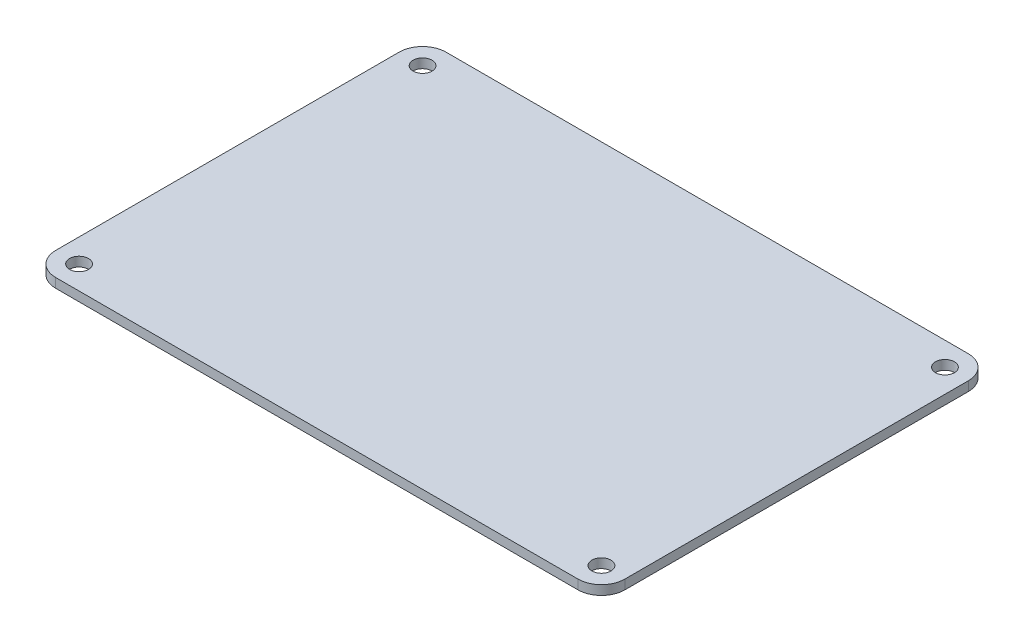
ISO-10303-21;
HEADER;
FILE_DESCRIPTION(('STEP AP214'),'2;1');
FILE_NAME('part.step','',(''),(''),'','','');
FILE_SCHEMA(('AUTOMOTIVE_DESIGN { 1 0 10303 214 1 1 1 1 }'));
ENDSEC;
DATA;
#1=APPLICATION_CONTEXT('core data for automotive mechanical design processes');
#2=APPLICATION_PROTOCOL_DEFINITION('international standard','automotive_design',2000,#1);
#3=PRODUCT_CONTEXT('',#1,'mechanical');
#4=PRODUCT('Part','Part','',(#3));
#5=PRODUCT_RELATED_PRODUCT_CATEGORY('part','',(#4));
#6=PRODUCT_DEFINITION_FORMATION('','',#4);
#7=PRODUCT_DEFINITION_CONTEXT('part definition',#1,'design');
#8=PRODUCT_DEFINITION('design','',#6,#7);
#9=PRODUCT_DEFINITION_SHAPE('','',#8);
#10=(LENGTH_UNIT() NAMED_UNIT(*) SI_UNIT(.MILLI.,.METRE.));
#11=(NAMED_UNIT(*) PLANE_ANGLE_UNIT() SI_UNIT($,.RADIAN.));
#12=(NAMED_UNIT(*) SI_UNIT($,.STERADIAN.) SOLID_ANGLE_UNIT());
#13=UNCERTAINTY_MEASURE_WITH_UNIT(LENGTH_MEASURE(1.E-05),#10,'distance_accuracy_value','');
#14=(GEOMETRIC_REPRESENTATION_CONTEXT(3) GLOBAL_UNCERTAINTY_ASSIGNED_CONTEXT((#13)) GLOBAL_UNIT_ASSIGNED_CONTEXT((#10,
#11,#12)) REPRESENTATION_CONTEXT('',''));
#15=CARTESIAN_POINT('',(0.,0.,0.));
#16=DIRECTION('',(0.,0.,1.));
#17=DIRECTION('',(1.,0.,0.));
#18=AXIS2_PLACEMENT_3D('',#15,#16,#17);
#19=CARTESIAN_POINT('',(0.,2.,-39.16));
#20=DIRECTION('',(0.,0.,1.));
#21=DIRECTION('',(1.,0.,0.));
#22=AXIS2_PLACEMENT_3D('',#19,#20,#21);
#23=PLANE('',#22);
#24=DIRECTION('',(-1.,0.,0.));
#25=VECTOR('',#24,1.);
#26=CARTESIAN_POINT('',(0.,1.,-39.16));
#27=LINE('',#26,#25);
#28=CARTESIAN_POINT('',(55.75,1.,-39.16));
#29=VERTEX_POINT('',#28);
#30=CARTESIAN_POINT('',(0.,1.,-39.16));
#31=VERTEX_POINT('',#30);
#32=EDGE_CURVE('E99',#29,#31,#27,.T.);
#33=ORIENTED_EDGE('',*,*,#32,.F.);
#34=DIRECTION('',(0.,-1.,0.));
#35=VECTOR('',#34,1.);
#36=CARTESIAN_POINT('',(55.75,2.,-39.16));
#37=LINE('',#36,#35);
#38=CARTESIAN_POINT('',(55.75,0.,-39.16));
#39=VERTEX_POINT('',#38);
#40=EDGE_CURVE('E11',#29,#39,#37,.T.);
#41=ORIENTED_EDGE('',*,*,#40,.T.);
#42=DIRECTION('',(-1.,0.,0.));
#43=VECTOR('',#42,1.);
#44=CARTESIAN_POINT('',(0.,0.,-39.16));
#45=LINE('',#44,#43);
#46=CARTESIAN_POINT('',(0.,0.,-39.16));
#47=VERTEX_POINT('',#46);
#48=EDGE_CURVE('E120',#39,#47,#45,.T.);
#49=ORIENTED_EDGE('',*,*,#48,.T.);
#50=DIRECTION('',(0.,-1.,0.));
#51=VECTOR('',#50,1.);
#52=CARTESIAN_POINT('',(0.,2.,-39.16));
#53=LINE('',#52,#51);
#54=EDGE_CURVE('E44',#31,#47,#53,.T.);
#55=ORIENTED_EDGE('',*,*,#54,.F.);
#56=EDGE_LOOP('',(#33,#41,#49,#55));
#57=FACE_BOUND('',#56,.T.);
#58=ADVANCED_FACE('F37',(#57),#23,.F.);
#59=CARTESIAN_POINT('',(-2.5,2.,0.));
#60=DIRECTION('',(1.,0.,0.));
#61=DIRECTION('',(0.,0.,-1.));
#62=AXIS2_PLACEMENT_3D('',#59,#60,#61);
#63=PLANE('',#62);
#64=DIRECTION('',(0.,0.,1.));
#65=VECTOR('',#64,1.);
#66=CARTESIAN_POINT('',(-2.5,1.,0.));
#67=LINE('',#66,#65);
#68=CARTESIAN_POINT('',(-2.5,1.,-36.66));
#69=VERTEX_POINT('',#68);
#70=CARTESIAN_POINT('',(-2.5,1.,0.));
#71=VERTEX_POINT('',#70);
#72=EDGE_CURVE('E116',#69,#71,#67,.T.);
#73=ORIENTED_EDGE('',*,*,#72,.F.);
#74=DIRECTION('',(0.,-1.,0.));
#75=VECTOR('',#74,1.);
#76=CARTESIAN_POINT('',(-2.5,2.,-36.66));
#77=LINE('',#76,#75);
#78=CARTESIAN_POINT('',(-2.5,0.,-36.66));
#79=VERTEX_POINT('',#78);
#80=EDGE_CURVE('E115',#69,#79,#77,.T.);
#81=ORIENTED_EDGE('',*,*,#80,.T.);
#82=DIRECTION('',(0.,0.,1.));
#83=VECTOR('',#82,1.);
#84=CARTESIAN_POINT('',(-2.5,0.,0.));
#85=LINE('',#84,#83);
#86=CARTESIAN_POINT('',(-2.5,0.,0.));
#87=VERTEX_POINT('',#86);
#88=EDGE_CURVE('E138',#79,#87,#85,.T.);
#89=ORIENTED_EDGE('',*,*,#88,.T.);
#90=DIRECTION('',(0.,-1.,0.));
#91=VECTOR('',#90,1.);
#92=CARTESIAN_POINT('',(-2.5,2.,0.));
#93=LINE('',#92,#91);
#94=EDGE_CURVE('E121',#71,#87,#93,.T.);
#95=ORIENTED_EDGE('',*,*,#94,.F.);
#96=EDGE_LOOP('',(#73,#81,#89,#95));
#97=FACE_BOUND('',#96,.T.);
#98=ADVANCED_FACE('F192',(#97),#63,.F.);
#99=CARTESIAN_POINT('',(0.,2.,2.5));
#100=DIRECTION('',(0.,0.,-1.));
#101=DIRECTION('',(-1.,0.,0.));
#102=AXIS2_PLACEMENT_3D('',#99,#100,#101);
#103=PLANE('',#102);
#104=DIRECTION('',(1.,0.,0.));
#105=VECTOR('',#104,1.);
#106=CARTESIAN_POINT('',(0.,1.,2.5));
#107=LINE('',#106,#105);
#108=CARTESIAN_POINT('',(0.,1.,2.5));
#109=VERTEX_POINT('',#108);
#110=CARTESIAN_POINT('',(55.75,1.,2.5));
#111=VERTEX_POINT('',#110);
#112=EDGE_CURVE('E180',#109,#111,#107,.T.);
#113=ORIENTED_EDGE('',*,*,#112,.F.);
#114=DIRECTION('',(0.,-1.,0.));
#115=VECTOR('',#114,1.);
#116=CARTESIAN_POINT('',(0.,2.,2.5));
#117=LINE('',#116,#115);
#118=CARTESIAN_POINT('',(0.,0.,2.5));
#119=VERTEX_POINT('',#118);
#120=EDGE_CURVE('E125',#109,#119,#117,.T.);
#121=ORIENTED_EDGE('',*,*,#120,.T.);
#122=DIRECTION('',(1.,0.,0.));
#123=VECTOR('',#122,1.);
#124=CARTESIAN_POINT('',(0.,0.,2.5));
#125=LINE('',#124,#123);
#126=CARTESIAN_POINT('',(55.75,0.,2.5));
#127=VERTEX_POINT('',#126);
#128=EDGE_CURVE('E135',#119,#127,#125,.T.);
#129=ORIENTED_EDGE('',*,*,#128,.T.);
#130=DIRECTION('',(0.,-1.,0.));
#131=VECTOR('',#130,1.);
#132=CARTESIAN_POINT('',(55.75,2.,2.5));
#133=LINE('',#132,#131);
#134=EDGE_CURVE('E127',#111,#127,#133,.T.);
#135=ORIENTED_EDGE('',*,*,#134,.F.);
#136=EDGE_LOOP('',(#113,#121,#129,#135));
#137=FACE_BOUND('',#136,.T.);
#138=ADVANCED_FACE('F202',(#137),#103,.F.);
#139=CARTESIAN_POINT('',(58.25,2.,0.));
#140=DIRECTION('',(-1.,0.,0.));
#141=DIRECTION('',(0.,0.,1.));
#142=AXIS2_PLACEMENT_3D('',#139,#140,#141);
#143=PLANE('',#142);
#144=DIRECTION('',(0.,0.,-1.));
#145=VECTOR('',#144,1.);
#146=CARTESIAN_POINT('',(58.25,1.,0.));
#147=LINE('',#146,#145);
#148=CARTESIAN_POINT('',(58.25,1.,0.));
#149=VERTEX_POINT('',#148);
#150=CARTESIAN_POINT('',(58.25,1.,-36.66));
#151=VERTEX_POINT('',#150);
#152=EDGE_CURVE('E51',#149,#151,#147,.T.);
#153=ORIENTED_EDGE('',*,*,#152,.F.);
#154=DIRECTION('',(0.,-1.,0.));
#155=VECTOR('',#154,1.);
#156=CARTESIAN_POINT('',(58.25,2.,0.));
#157=LINE('',#156,#155);
#158=CARTESIAN_POINT('',(58.25,0.,0.));
#159=VERTEX_POINT('',#158);
#160=EDGE_CURVE('E129',#149,#159,#157,.T.);
#161=ORIENTED_EDGE('',*,*,#160,.T.);
#162=DIRECTION('',(0.,0.,-1.));
#163=VECTOR('',#162,1.);
#164=CARTESIAN_POINT('',(58.25,0.,0.));
#165=LINE('',#164,#163);
#166=CARTESIAN_POINT('',(58.25,0.,-36.66));
#167=VERTEX_POINT('',#166);
#168=EDGE_CURVE('E132',#159,#167,#165,.T.);
#169=ORIENTED_EDGE('',*,*,#168,.T.);
#170=DIRECTION('',(0.,-1.,0.));
#171=VECTOR('',#170,1.);
#172=CARTESIAN_POINT('',(58.25,2.,-36.66));
#173=LINE('',#172,#171);
#174=EDGE_CURVE('E58',#151,#167,#173,.T.);
#175=ORIENTED_EDGE('',*,*,#174,.F.);
#176=EDGE_LOOP('',(#153,#161,#169,#175));
#177=FACE_BOUND('',#176,.T.);
#178=ADVANCED_FACE('F208',(#177),#143,.F.);
#179=CARTESIAN_POINT('',(55.75,2.,0.));
#180=DIRECTION('',(0.,-1.,0.));
#181=DIRECTION('',(0.,0.,-1.));
#182=AXIS2_PLACEMENT_3D('',#179,#180,#181);
#183=CYLINDRICAL_SURFACE('',#182,1.012);
#184=CARTESIAN_POINT('',(55.75,0.,0.));
#185=DIRECTION('',(0.,1.,0.));
#186=DIRECTION('',(0.,0.,1.));
#187=AXIS2_PLACEMENT_3D('',#184,#185,#186);
#188=CIRCLE('',#187,1.012);
#189=CARTESIAN_POINT('',(55.75,0.,1.012));
#190=VERTEX_POINT('',#189);
#191=EDGE_CURVE('E145',#190,#190,#188,.T.);
#192=ORIENTED_EDGE('',*,*,#191,.F.);
#193=EDGE_LOOP('',(#192));
#194=FACE_BOUND('',#193,.T.);
#195=CARTESIAN_POINT('',(55.75,1.,0.));
#196=DIRECTION('',(0.,1.,0.));
#197=DIRECTION('',(0.,0.,1.));
#198=AXIS2_PLACEMENT_3D('',#195,#196,#197);
#199=CIRCLE('',#198,1.012);
#200=CARTESIAN_POINT('',(55.75,1.,1.012));
#201=VERTEX_POINT('',#200);
#202=EDGE_CURVE('E173',#201,#201,#199,.F.);
#203=ORIENTED_EDGE('',*,*,#202,.F.);
#204=EDGE_LOOP('',(#203));
#205=FACE_BOUND('',#204,.T.);
#206=ADVANCED_FACE('F233',(#194,#205),#183,.F.);
#207=CARTESIAN_POINT('',(55.75,2.,0.));
#208=DIRECTION('',(0.,-1.,0.));
#209=DIRECTION('',(0.,0.,-1.));
#210=AXIS2_PLACEMENT_3D('',#207,#208,#209);
#211=CYLINDRICAL_SURFACE('',#210,2.5);
#212=CARTESIAN_POINT('',(55.75,1.,0.));
#213=DIRECTION('',(0.,1.,0.));
#214=DIRECTION('',(0.,0.,1.));
#215=AXIS2_PLACEMENT_3D('',#212,#213,#214);
#216=CIRCLE('',#215,2.5);
#217=EDGE_CURVE('E178',#111,#149,#216,.T.);
#218=ORIENTED_EDGE('',*,*,#217,.F.);
#219=ORIENTED_EDGE('',*,*,#134,.T.);
#220=CARTESIAN_POINT('',(55.75,0.,0.));
#221=DIRECTION('',(0.,1.,0.));
#222=DIRECTION('',(0.,0.,1.));
#223=AXIS2_PLACEMENT_3D('',#220,#221,#222);
#224=CIRCLE('',#223,2.5);
#225=EDGE_CURVE('E142',#127,#159,#224,.T.);
#226=ORIENTED_EDGE('',*,*,#225,.T.);
#227=ORIENTED_EDGE('',*,*,#160,.F.);
#228=EDGE_LOOP('',(#218,#219,#226,#227));
#229=FACE_BOUND('',#228,.T.);
#230=ADVANCED_FACE('F206',(#229),#211,.T.);
#231=CARTESIAN_POINT('',(0.,2.,0.));
#232=DIRECTION('',(0.,-1.,0.));
#233=DIRECTION('',(0.,0.,-1.));
#234=AXIS2_PLACEMENT_3D('',#231,#232,#233);
#235=CYLINDRICAL_SURFACE('',#234,2.5);
#236=CARTESIAN_POINT('',(0.,1.,0.));
#237=DIRECTION('',(0.,1.,0.));
#238=DIRECTION('',(0.,0.,1.));
#239=AXIS2_PLACEMENT_3D('',#236,#237,#238);
#240=CIRCLE('',#239,2.5);
#241=EDGE_CURVE('E182',#71,#109,#240,.T.);
#242=ORIENTED_EDGE('',*,*,#241,.F.);
#243=ORIENTED_EDGE('',*,*,#94,.T.);
#244=CARTESIAN_POINT('',(0.,0.,0.));
#245=DIRECTION('',(0.,1.,0.));
#246=DIRECTION('',(0.,0.,1.));
#247=AXIS2_PLACEMENT_3D('',#244,#245,#246);
#248=CIRCLE('',#247,2.5);
#249=EDGE_CURVE('E151',#87,#119,#248,.T.);
#250=ORIENTED_EDGE('',*,*,#249,.T.);
#251=ORIENTED_EDGE('',*,*,#120,.F.);
#252=EDGE_LOOP('',(#242,#243,#250,#251));
#253=FACE_BOUND('',#252,.T.);
#254=ADVANCED_FACE('F190',(#253),#235,.T.);
#255=CARTESIAN_POINT('',(0.,2.,0.));
#256=DIRECTION('',(0.,-1.,0.));
#257=DIRECTION('',(0.,0.,-1.));
#258=AXIS2_PLACEMENT_3D('',#255,#256,#257);
#259=CYLINDRICAL_SURFACE('',#258,1.012);
#260=CARTESIAN_POINT('',(0.,0.,0.));
#261=DIRECTION('',(0.,1.,0.));
#262=DIRECTION('',(0.,0.,1.));
#263=AXIS2_PLACEMENT_3D('',#260,#261,#262);
#264=CIRCLE('',#263,1.012);
#265=CARTESIAN_POINT('',(0.,0.,1.012));
#266=VERTEX_POINT('',#265);
#267=EDGE_CURVE('E148',#266,#266,#264,.T.);
#268=ORIENTED_EDGE('',*,*,#267,.F.);
#269=EDGE_LOOP('',(#268));
#270=FACE_BOUND('',#269,.T.);
#271=CARTESIAN_POINT('',(0.,1.,0.));
#272=DIRECTION('',(0.,1.,0.));
#273=DIRECTION('',(0.,0.,1.));
#274=AXIS2_PLACEMENT_3D('',#271,#272,#273);
#275=CIRCLE('',#274,1.012);
#276=CARTESIAN_POINT('',(0.,1.,1.012));
#277=VERTEX_POINT('',#276);
#278=EDGE_CURVE('E164',#277,#277,#275,.F.);
#279=ORIENTED_EDGE('',*,*,#278,.F.);
#280=EDGE_LOOP('',(#279));
#281=FACE_BOUND('',#280,.T.);
#282=ADVANCED_FACE('F243',(#270,#281),#259,.F.);
#283=CARTESIAN_POINT('',(0.,2.,-36.66));
#284=DIRECTION('',(0.,-1.,0.));
#285=DIRECTION('',(0.,0.,-1.));
#286=AXIS2_PLACEMENT_3D('',#283,#284,#285);
#287=CYLINDRICAL_SURFACE('',#286,2.5);
#288=CARTESIAN_POINT('',(0.,1.,-36.66));
#289=DIRECTION('',(0.,1.,0.));
#290=DIRECTION('',(0.,0.,1.));
#291=AXIS2_PLACEMENT_3D('',#288,#289,#290);
#292=CIRCLE('',#291,2.5);
#293=EDGE_CURVE('E103',#31,#69,#292,.T.);
#294=ORIENTED_EDGE('',*,*,#293,.F.);
#295=ORIENTED_EDGE('',*,*,#54,.T.);
#296=CARTESIAN_POINT('',(0.,0.,-36.66));
#297=DIRECTION('',(0.,1.,0.));
#298=DIRECTION('',(0.,0.,1.));
#299=AXIS2_PLACEMENT_3D('',#296,#297,#298);
#300=CIRCLE('',#299,2.5);
#301=EDGE_CURVE('E157',#47,#79,#300,.T.);
#302=ORIENTED_EDGE('',*,*,#301,.T.);
#303=ORIENTED_EDGE('',*,*,#80,.F.);
#304=EDGE_LOOP('',(#294,#295,#302,#303));
#305=FACE_BOUND('',#304,.T.);
#306=ADVANCED_FACE('F112',(#305),#287,.T.);
#307=CARTESIAN_POINT('',(0.,2.,-36.66));
#308=DIRECTION('',(0.,-1.,0.));
#309=DIRECTION('',(0.,0.,-1.));
#310=AXIS2_PLACEMENT_3D('',#307,#308,#309);
#311=CYLINDRICAL_SURFACE('',#310,1.012);
#312=CARTESIAN_POINT('',(0.,0.,-36.66));
#313=DIRECTION('',(0.,1.,0.));
#314=DIRECTION('',(0.,0.,1.));
#315=AXIS2_PLACEMENT_3D('',#312,#313,#314);
#316=CIRCLE('',#315,1.012);
#317=CARTESIAN_POINT('',(0.,0.,-35.648));
#318=VERTEX_POINT('',#317);
#319=EDGE_CURVE('E154',#318,#318,#316,.T.);
#320=ORIENTED_EDGE('',*,*,#319,.F.);
#321=EDGE_LOOP('',(#320));
#322=FACE_BOUND('',#321,.T.);
#323=CARTESIAN_POINT('',(0.,1.,-36.66));
#324=DIRECTION('',(0.,1.,0.));
#325=DIRECTION('',(0.,0.,1.));
#326=AXIS2_PLACEMENT_3D('',#323,#324,#325);
#327=CIRCLE('',#326,1.012);
#328=CARTESIAN_POINT('',(0.,1.,-35.648));
#329=VERTEX_POINT('',#328);
#330=EDGE_CURVE('E170',#329,#329,#327,.F.);
#331=ORIENTED_EDGE('',*,*,#330,.F.);
#332=EDGE_LOOP('',(#331));
#333=FACE_BOUND('',#332,.T.);
#334=ADVANCED_FACE('F212',(#322,#333),#311,.F.);
#335=CARTESIAN_POINT('',(55.75,2.,-36.66));
#336=DIRECTION('',(0.,-1.,0.));
#337=DIRECTION('',(0.,0.,-1.));
#338=AXIS2_PLACEMENT_3D('',#335,#336,#337);
#339=CYLINDRICAL_SURFACE('',#338,2.5);
#340=CARTESIAN_POINT('',(55.75,1.,-36.66));
#341=DIRECTION('',(0.,1.,0.));
#342=DIRECTION('',(0.,0.,1.));
#343=AXIS2_PLACEMENT_3D('',#340,#341,#342);
#344=CIRCLE('',#343,2.5);
#345=EDGE_CURVE('E105',#151,#29,#344,.T.);
#346=ORIENTED_EDGE('',*,*,#345,.F.);
#347=ORIENTED_EDGE('',*,*,#174,.T.);
#348=CARTESIAN_POINT('',(55.75,0.,-36.66));
#349=DIRECTION('',(0.,1.,0.));
#350=DIRECTION('',(0.,0.,1.));
#351=AXIS2_PLACEMENT_3D('',#348,#349,#350);
#352=CIRCLE('',#351,2.5);
#353=EDGE_CURVE('E162',#167,#39,#352,.T.);
#354=ORIENTED_EDGE('',*,*,#353,.T.);
#355=ORIENTED_EDGE('',*,*,#40,.F.);
#356=EDGE_LOOP('',(#346,#347,#354,#355));
#357=FACE_BOUND('',#356,.T.);
#358=ADVANCED_FACE('F209',(#357),#339,.T.);
#359=CARTESIAN_POINT('',(55.75,2.,-36.66));
#360=DIRECTION('',(0.,-1.,0.));
#361=DIRECTION('',(0.,0.,-1.));
#362=AXIS2_PLACEMENT_3D('',#359,#360,#361);
#363=CYLINDRICAL_SURFACE('',#362,1.012);
#364=CARTESIAN_POINT('',(55.75,0.,-36.66));
#365=DIRECTION('',(0.,1.,0.));
#366=DIRECTION('',(0.,0.,1.));
#367=AXIS2_PLACEMENT_3D('',#364,#365,#366);
#368=CIRCLE('',#367,1.012);
#369=CARTESIAN_POINT('',(55.75,0.,-35.648));
#370=VERTEX_POINT('',#369);
#371=EDGE_CURVE('E159',#370,#370,#368,.T.);
#372=ORIENTED_EDGE('',*,*,#371,.F.);
#373=EDGE_LOOP('',(#372));
#374=FACE_BOUND('',#373,.T.);
#375=CARTESIAN_POINT('',(55.75,1.,-36.66));
#376=DIRECTION('',(0.,1.,0.));
#377=DIRECTION('',(0.,0.,1.));
#378=AXIS2_PLACEMENT_3D('',#375,#376,#377);
#379=CIRCLE('',#378,1.012);
#380=CARTESIAN_POINT('',(55.75,1.,-35.648));
#381=VERTEX_POINT('',#380);
#382=EDGE_CURVE('E167',#381,#381,#379,.F.);
#383=ORIENTED_EDGE('',*,*,#382,.F.);
#384=EDGE_LOOP('',(#383));
#385=FACE_BOUND('',#384,.T.);
#386=ADVANCED_FACE('F211',(#374,#385),#363,.F.);
#387=CARTESIAN_POINT('',(0.,0.,0.));
#388=DIRECTION('',(0.,1.,0.));
#389=DIRECTION('',(0.,0.,1.));
#390=AXIS2_PLACEMENT_3D('',#387,#388,#389);
#391=PLANE('',#390);
#392=ORIENTED_EDGE('',*,*,#48,.F.);
#393=ORIENTED_EDGE('',*,*,#353,.F.);
#394=ORIENTED_EDGE('',*,*,#168,.F.);
#395=ORIENTED_EDGE('',*,*,#225,.F.);
#396=ORIENTED_EDGE('',*,*,#128,.F.);
#397=ORIENTED_EDGE('',*,*,#249,.F.);
#398=ORIENTED_EDGE('',*,*,#88,.F.);
#399=ORIENTED_EDGE('',*,*,#301,.F.);
#400=EDGE_LOOP('',(#392,#393,#394,#395,#396,#397,#398,#399));
#401=FACE_BOUND('',#400,.T.);
#402=ORIENTED_EDGE('',*,*,#191,.T.);
#403=EDGE_LOOP('',(#402));
#404=FACE_BOUND('',#403,.T.);
#405=ORIENTED_EDGE('',*,*,#267,.T.);
#406=EDGE_LOOP('',(#405));
#407=FACE_BOUND('',#406,.T.);
#408=ORIENTED_EDGE('',*,*,#319,.T.);
#409=EDGE_LOOP('',(#408));
#410=FACE_BOUND('',#409,.T.);
#411=ORIENTED_EDGE('',*,*,#371,.T.);
#412=EDGE_LOOP('',(#411));
#413=FACE_BOUND('',#412,.T.);
#414=ADVANCED_FACE('F195',(#401,#404,#407,#410,#413),#391,.F.);
#415=CARTESIAN_POINT('',(0.,1.,0.));
#416=DIRECTION('',(0.,1.,0.));
#417=DIRECTION('',(0.,0.,1.));
#418=AXIS2_PLACEMENT_3D('',#415,#416,#417);
#419=PLANE('',#418);
#420=ORIENTED_EDGE('',*,*,#32,.T.);
#421=ORIENTED_EDGE('',*,*,#293,.T.);
#422=ORIENTED_EDGE('',*,*,#72,.T.);
#423=ORIENTED_EDGE('',*,*,#241,.T.);
#424=ORIENTED_EDGE('',*,*,#112,.T.);
#425=ORIENTED_EDGE('',*,*,#217,.T.);
#426=ORIENTED_EDGE('',*,*,#152,.T.);
#427=ORIENTED_EDGE('',*,*,#345,.T.);
#428=EDGE_LOOP('',(#420,#421,#422,#423,#424,#425,#426,#427));
#429=FACE_BOUND('',#428,.T.);
#430=ORIENTED_EDGE('',*,*,#202,.T.);
#431=EDGE_LOOP('',(#430));
#432=FACE_BOUND('',#431,.T.);
#433=ORIENTED_EDGE('',*,*,#330,.T.);
#434=EDGE_LOOP('',(#433));
#435=FACE_BOUND('',#434,.T.);
#436=ORIENTED_EDGE('',*,*,#382,.T.);
#437=EDGE_LOOP('',(#436));
#438=FACE_BOUND('',#437,.T.);
#439=ORIENTED_EDGE('',*,*,#278,.T.);
#440=EDGE_LOOP('',(#439));
#441=FACE_BOUND('',#440,.T.);
#442=ADVANCED_FACE('F101',(#429,#432,#435,#438,#441),#419,.T.);
#443=CLOSED_SHELL('',(#58,#98,#138,#178,#206,#230,#254,#282,#306,#334,#358,#386,#414,#442));
#444=MANIFOLD_SOLID_BREP('B2',#443);
#445=ADVANCED_BREP_SHAPE_REPRESENTATION('',(#18,#444),#14);
#446=SHAPE_DEFINITION_REPRESENTATION(#9,#445);
ENDSEC;
END-ISO-10303-21;
